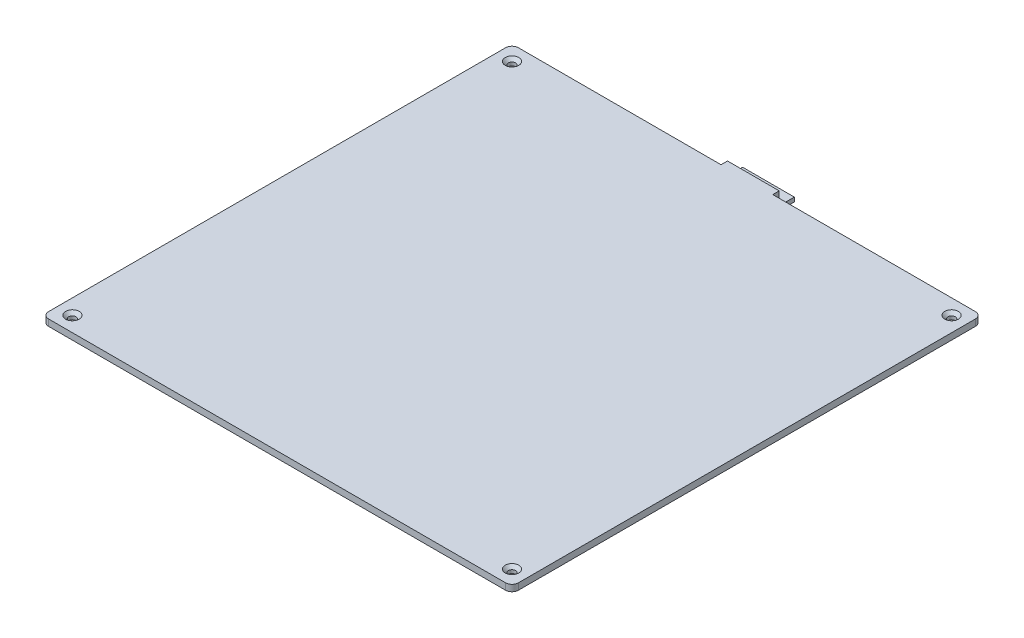
ISO-10303-21;
HEADER;
FILE_DESCRIPTION(('STEP AP214'),'2;1');
FILE_NAME('part.step','',(''),(''),'','','');
FILE_SCHEMA(('AUTOMOTIVE_DESIGN { 1 0 10303 214 1 1 1 1 }'));
ENDSEC;
DATA;
#1=APPLICATION_CONTEXT('core data for automotive mechanical design processes');
#2=APPLICATION_PROTOCOL_DEFINITION('international standard','automotive_design',2000,#1);
#3=PRODUCT_CONTEXT('',#1,'mechanical');
#4=PRODUCT('Part','Part','',(#3));
#5=PRODUCT_RELATED_PRODUCT_CATEGORY('part','',(#4));
#6=PRODUCT_DEFINITION_FORMATION('','',#4);
#7=PRODUCT_DEFINITION_CONTEXT('part definition',#1,'design');
#8=PRODUCT_DEFINITION('design','',#6,#7);
#9=PRODUCT_DEFINITION_SHAPE('','',#8);
#10=(LENGTH_UNIT() NAMED_UNIT(*) SI_UNIT(.MILLI.,.METRE.));
#11=(NAMED_UNIT(*) PLANE_ANGLE_UNIT() SI_UNIT($,.RADIAN.));
#12=(NAMED_UNIT(*) SI_UNIT($,.STERADIAN.) SOLID_ANGLE_UNIT());
#13=UNCERTAINTY_MEASURE_WITH_UNIT(LENGTH_MEASURE(1.E-05),#10,'distance_accuracy_value','');
#14=(GEOMETRIC_REPRESENTATION_CONTEXT(3) GLOBAL_UNCERTAINTY_ASSIGNED_CONTEXT((#13)) GLOBAL_UNIT_ASSIGNED_CONTEXT((#10,
#11,#12)) REPRESENTATION_CONTEXT('',''));
#15=CARTESIAN_POINT('',(0.,0.,0.));
#16=DIRECTION('',(0.,0.,1.));
#17=DIRECTION('',(1.,0.,0.));
#18=AXIS2_PLACEMENT_3D('',#15,#16,#17);
#19=CARTESIAN_POINT('',(-12.,-5.,-119.));
#20=DIRECTION('',(0.,0.,1.));
#21=DIRECTION('',(1.,0.,0.));
#22=AXIS2_PLACEMENT_3D('',#19,#20,#21);
#23=PLANE('',#22);
#24=DIRECTION('',(-1.,0.,0.));
#25=VECTOR('',#24,1.);
#26=CARTESIAN_POINT('',(12.,-3.,-119.));
#27=LINE('',#26,#25);
#28=CARTESIAN_POINT('',(12.,-3.,-119.));
#29=VERTEX_POINT('',#28);
#30=CARTESIAN_POINT('',(-12.,-3.,-119.));
#31=VERTEX_POINT('',#30);
#32=EDGE_CURVE('E155',#29,#31,#27,.T.);
#33=ORIENTED_EDGE('',*,*,#32,.F.);
#34=DIRECTION('',(0.,1.,0.));
#35=VECTOR('',#34,1.);
#36=CARTESIAN_POINT('',(12.,-5.,-119.));
#37=LINE('',#36,#35);
#38=CARTESIAN_POINT('',(12.,-5.,-119.));
#39=VERTEX_POINT('',#38);
#40=EDGE_CURVE('E185',#39,#29,#37,.T.);
#41=ORIENTED_EDGE('',*,*,#40,.F.);
#42=DIRECTION('',(1.,0.,0.));
#43=VECTOR('',#42,1.);
#44=CARTESIAN_POINT('',(-12.,-5.,-119.));
#45=LINE('',#44,#43);
#46=CARTESIAN_POINT('',(-12.,-5.,-119.));
#47=VERTEX_POINT('',#46);
#48=EDGE_CURVE('E175',#47,#39,#45,.T.);
#49=ORIENTED_EDGE('',*,*,#48,.F.);
#50=DIRECTION('',(0.,1.,0.));
#51=VECTOR('',#50,1.);
#52=CARTESIAN_POINT('',(-12.,-5.,-119.));
#53=LINE('',#52,#51);
#54=EDGE_CURVE('E188',#47,#31,#53,.T.);
#55=ORIENTED_EDGE('',*,*,#54,.T.);
#56=EDGE_LOOP('',(#33,#41,#49,#55));
#57=FACE_BOUND('',#56,.T.);
#58=ADVANCED_FACE('F36',(#57),#23,.F.);
#59=CARTESIAN_POINT('',(-106.,3.,-109.));
#60=DIRECTION('',(0.,0.,1.));
#61=DIRECTION('',(1.,0.,0.));
#62=AXIS2_PLACEMENT_3D('',#59,#60,#61);
#63=PLANE('',#62);
#64=DIRECTION('',(0.,1.,0.));
#65=VECTOR('',#64,1.);
#66=CARTESIAN_POINT('',(-12.,-5.,-109.));
#67=LINE('',#66,#65);
#68=CARTESIAN_POINT('',(-12.,0.,-109.));
#69=VERTEX_POINT('',#68);
#70=CARTESIAN_POINT('',(-12.,3.,-109.));
#71=VERTEX_POINT('',#70);
#72=EDGE_CURVE('E190',#69,#71,#67,.T.);
#73=ORIENTED_EDGE('',*,*,#72,.F.);
#74=DIRECTION('',(-1.,0.,0.));
#75=VECTOR('',#74,1.);
#76=CARTESIAN_POINT('',(-106.,0.,-109.));
#77=LINE('',#76,#75);
#78=CARTESIAN_POINT('',(-106.,0.,-109.));
#79=VERTEX_POINT('',#78);
#80=EDGE_CURVE('E261',#69,#79,#77,.T.);
#81=ORIENTED_EDGE('',*,*,#80,.T.);
#82=DIRECTION('',(0.,-1.,0.));
#83=VECTOR('',#82,1.);
#84=CARTESIAN_POINT('',(-106.,3.,-109.));
#85=LINE('',#84,#83);
#86=CARTESIAN_POINT('',(-106.,3.,-109.));
#87=VERTEX_POINT('',#86);
#88=EDGE_CURVE('E274',#87,#79,#85,.T.);
#89=ORIENTED_EDGE('',*,*,#88,.F.);
#90=DIRECTION('',(-1.,0.,0.));
#91=VECTOR('',#90,1.);
#92=CARTESIAN_POINT('',(-106.,3.,-109.));
#93=LINE('',#92,#91);
#94=EDGE_CURVE('E59',#71,#87,#93,.T.);
#95=ORIENTED_EDGE('',*,*,#94,.F.);
#96=EDGE_LOOP('',(#73,#81,#89,#95));
#97=FACE_BOUND('',#96,.T.);
#98=ADVANCED_FACE('F326',(#97),#63,.F.);
#99=DIRECTION('',(0.,1.,0.));
#100=VECTOR('',#99,1.);
#101=CARTESIAN_POINT('',(12.,-5.,-109.));
#102=LINE('',#101,#100);
#103=CARTESIAN_POINT('',(12.,0.,-109.));
#104=VERTEX_POINT('',#103);
#105=CARTESIAN_POINT('',(12.,3.,-109.));
#106=VERTEX_POINT('',#105);
#107=EDGE_CURVE('E179',#104,#106,#102,.T.);
#108=ORIENTED_EDGE('',*,*,#107,.T.);
#109=CARTESIAN_POINT('',(106.,3.,-109.));
#110=VERTEX_POINT('',#109);
#111=EDGE_CURVE('E243',#110,#106,#93,.T.);
#112=ORIENTED_EDGE('',*,*,#111,.F.);
#113=DIRECTION('',(0.,-1.,0.));
#114=VECTOR('',#113,1.);
#115=CARTESIAN_POINT('',(106.,3.,-109.));
#116=LINE('',#115,#114);
#117=CARTESIAN_POINT('',(106.,0.,-109.));
#118=VERTEX_POINT('',#117);
#119=EDGE_CURVE('E277',#110,#118,#116,.T.);
#120=ORIENTED_EDGE('',*,*,#119,.T.);
#121=EDGE_CURVE('E262',#118,#104,#77,.T.);
#122=ORIENTED_EDGE('',*,*,#121,.T.);
#123=EDGE_LOOP('',(#108,#112,#120,#122));
#124=FACE_BOUND('',#123,.T.);
#125=ADVANCED_FACE('F344',(#124),#63,.F.);
#126=CARTESIAN_POINT('',(-106.,3.,106.));
#127=DIRECTION('',(0.,-1.,0.));
#128=DIRECTION('',(0.,0.,-1.));
#129=AXIS2_PLACEMENT_3D('',#126,#127,#128);
#130=CYLINDRICAL_SURFACE('',#129,3.);
#131=CARTESIAN_POINT('',(-106.,0.,106.));
#132=DIRECTION('',(0.,1.,0.));
#133=DIRECTION('',(0.,0.,1.));
#134=AXIS2_PLACEMENT_3D('',#131,#132,#133);
#135=CIRCLE('',#134,3.);
#136=CARTESIAN_POINT('',(-109.,0.,106.));
#137=VERTEX_POINT('',#136);
#138=CARTESIAN_POINT('',(-106.,0.,109.));
#139=VERTEX_POINT('',#138);
#140=EDGE_CURVE('E230',#137,#139,#135,.T.);
#141=ORIENTED_EDGE('',*,*,#140,.T.);
#142=DIRECTION('',(0.,-1.,0.));
#143=VECTOR('',#142,1.);
#144=CARTESIAN_POINT('',(-106.,3.,109.));
#145=LINE('',#144,#143);
#146=CARTESIAN_POINT('',(-106.,3.,109.));
#147=VERTEX_POINT('',#146);
#148=EDGE_CURVE('E11',#147,#139,#145,.T.);
#149=ORIENTED_EDGE('',*,*,#148,.F.);
#150=CARTESIAN_POINT('',(-106.,3.,106.));
#151=DIRECTION('',(0.,1.,0.));
#152=DIRECTION('',(0.,0.,1.));
#153=AXIS2_PLACEMENT_3D('',#150,#151,#152);
#154=CIRCLE('',#153,3.);
#155=CARTESIAN_POINT('',(-109.,3.,106.));
#156=VERTEX_POINT('',#155);
#157=EDGE_CURVE('E231',#156,#147,#154,.T.);
#158=ORIENTED_EDGE('',*,*,#157,.F.);
#159=DIRECTION('',(0.,-1.,0.));
#160=VECTOR('',#159,1.);
#161=CARTESIAN_POINT('',(-109.,3.,106.));
#162=LINE('',#161,#160);
#163=EDGE_CURVE('E250',#156,#137,#162,.T.);
#164=ORIENTED_EDGE('',*,*,#163,.T.);
#165=EDGE_LOOP('',(#141,#149,#158,#164));
#166=FACE_BOUND('',#165,.T.);
#167=ADVANCED_FACE('F38',(#166),#130,.T.);
#168=CARTESIAN_POINT('',(-106.,3.,109.));
#169=DIRECTION('',(0.,0.,-1.));
#170=DIRECTION('',(-1.,0.,0.));
#171=AXIS2_PLACEMENT_3D('',#168,#169,#170);
#172=PLANE('',#171);
#173=DIRECTION('',(1.,0.,0.));
#174=VECTOR('',#173,1.);
#175=CARTESIAN_POINT('',(-106.,0.,109.));
#176=LINE('',#175,#174);
#177=CARTESIAN_POINT('',(106.,0.,109.));
#178=VERTEX_POINT('',#177);
#179=EDGE_CURVE('E253',#139,#178,#176,.T.);
#180=ORIENTED_EDGE('',*,*,#179,.T.);
#181=DIRECTION('',(0.,-1.,0.));
#182=VECTOR('',#181,1.);
#183=CARTESIAN_POINT('',(106.,3.,109.));
#184=LINE('',#183,#182);
#185=CARTESIAN_POINT('',(106.,3.,109.));
#186=VERTEX_POINT('',#185);
#187=EDGE_CURVE('E44',#186,#178,#184,.T.);
#188=ORIENTED_EDGE('',*,*,#187,.F.);
#189=DIRECTION('',(1.,0.,0.));
#190=VECTOR('',#189,1.);
#191=CARTESIAN_POINT('',(-106.,3.,109.));
#192=LINE('',#191,#190);
#193=EDGE_CURVE('E234',#147,#186,#192,.T.);
#194=ORIENTED_EDGE('',*,*,#193,.F.);
#195=ORIENTED_EDGE('',*,*,#148,.T.);
#196=EDGE_LOOP('',(#180,#188,#194,#195));
#197=FACE_BOUND('',#196,.T.);
#198=ADVANCED_FACE('F314',(#197),#172,.F.);
#199=CARTESIAN_POINT('',(106.,3.,106.));
#200=DIRECTION('',(0.,-1.,0.));
#201=DIRECTION('',(0.,0.,-1.));
#202=AXIS2_PLACEMENT_3D('',#199,#200,#201);
#203=CYLINDRICAL_SURFACE('',#202,3.);
#204=CARTESIAN_POINT('',(106.,0.,106.));
#205=DIRECTION('',(0.,1.,0.));
#206=DIRECTION('',(0.,0.,1.));
#207=AXIS2_PLACEMENT_3D('',#204,#205,#206);
#208=CIRCLE('',#207,3.);
#209=CARTESIAN_POINT('',(109.,0.,106.));
#210=VERTEX_POINT('',#209);
#211=EDGE_CURVE('E255',#178,#210,#208,.T.);
#212=ORIENTED_EDGE('',*,*,#211,.T.);
#213=DIRECTION('',(0.,-1.,0.));
#214=VECTOR('',#213,1.);
#215=CARTESIAN_POINT('',(109.,3.,106.));
#216=LINE('',#215,#214);
#217=CARTESIAN_POINT('',(109.,3.,106.));
#218=VERTEX_POINT('',#217);
#219=EDGE_CURVE('E283',#218,#210,#216,.T.);
#220=ORIENTED_EDGE('',*,*,#219,.F.);
#221=CARTESIAN_POINT('',(106.,3.,106.));
#222=DIRECTION('',(0.,1.,0.));
#223=DIRECTION('',(0.,0.,1.));
#224=AXIS2_PLACEMENT_3D('',#221,#222,#223);
#225=CIRCLE('',#224,3.);
#226=EDGE_CURVE('E237',#186,#218,#225,.T.);
#227=ORIENTED_EDGE('',*,*,#226,.F.);
#228=ORIENTED_EDGE('',*,*,#187,.T.);
#229=EDGE_LOOP('',(#212,#220,#227,#228));
#230=FACE_BOUND('',#229,.T.);
#231=ADVANCED_FACE('F290',(#230),#203,.T.);
#232=CARTESIAN_POINT('',(109.,3.,-106.));
#233=DIRECTION('',(-1.,0.,0.));
#234=DIRECTION('',(0.,0.,1.));
#235=AXIS2_PLACEMENT_3D('',#232,#233,#234);
#236=PLANE('',#235);
#237=DIRECTION('',(0.,0.,-1.));
#238=VECTOR('',#237,1.);
#239=CARTESIAN_POINT('',(109.,0.,-106.));
#240=LINE('',#239,#238);
#241=CARTESIAN_POINT('',(109.,0.,-106.));
#242=VERTEX_POINT('',#241);
#243=EDGE_CURVE('E257',#210,#242,#240,.T.);
#244=ORIENTED_EDGE('',*,*,#243,.T.);
#245=DIRECTION('',(0.,-1.,0.));
#246=VECTOR('',#245,1.);
#247=CARTESIAN_POINT('',(109.,3.,-106.));
#248=LINE('',#247,#246);
#249=CARTESIAN_POINT('',(109.,3.,-106.));
#250=VERTEX_POINT('',#249);
#251=EDGE_CURVE('E280',#250,#242,#248,.T.);
#252=ORIENTED_EDGE('',*,*,#251,.F.);
#253=DIRECTION('',(0.,0.,-1.));
#254=VECTOR('',#253,1.);
#255=CARTESIAN_POINT('',(109.,3.,-106.));
#256=LINE('',#255,#254);
#257=EDGE_CURVE('E239',#218,#250,#256,.T.);
#258=ORIENTED_EDGE('',*,*,#257,.F.);
#259=ORIENTED_EDGE('',*,*,#219,.T.);
#260=EDGE_LOOP('',(#244,#252,#258,#259));
#261=FACE_BOUND('',#260,.T.);
#262=ADVANCED_FACE('F301',(#261),#236,.F.);
#263=CARTESIAN_POINT('',(106.,3.,-106.));
#264=DIRECTION('',(0.,-1.,0.));
#265=DIRECTION('',(0.,0.,-1.));
#266=AXIS2_PLACEMENT_3D('',#263,#264,#265);
#267=CYLINDRICAL_SURFACE('',#266,3.00000000000001);
#268=CARTESIAN_POINT('',(106.,0.,-106.));
#269=DIRECTION('',(0.,1.,0.));
#270=DIRECTION('',(0.,0.,-1.));
#271=AXIS2_PLACEMENT_3D('',#268,#269,#270);
#272=CIRCLE('',#271,3.00000000000001);
#273=EDGE_CURVE('E259',#242,#118,#272,.T.);
#274=ORIENTED_EDGE('',*,*,#273,.T.);
#275=ORIENTED_EDGE('',*,*,#119,.F.);
#276=CARTESIAN_POINT('',(106.,3.,-106.));
#277=DIRECTION('',(0.,1.,0.));
#278=DIRECTION('',(0.,0.,-1.));
#279=AXIS2_PLACEMENT_3D('',#276,#277,#278);
#280=CIRCLE('',#279,3.00000000000001);
#281=EDGE_CURVE('E241',#250,#110,#280,.T.);
#282=ORIENTED_EDGE('',*,*,#281,.F.);
#283=ORIENTED_EDGE('',*,*,#251,.T.);
#284=EDGE_LOOP('',(#274,#275,#282,#283));
#285=FACE_BOUND('',#284,.T.);
#286=ADVANCED_FACE('F305',(#285),#267,.T.);
#287=CARTESIAN_POINT('',(-106.,3.,-106.));
#288=DIRECTION('',(0.,-1.,0.));
#289=DIRECTION('',(0.,0.,-1.));
#290=AXIS2_PLACEMENT_3D('',#287,#288,#289);
#291=CYLINDRICAL_SURFACE('',#290,3.);
#292=CARTESIAN_POINT('',(-106.,0.,-106.));
#293=DIRECTION('',(0.,1.,0.));
#294=DIRECTION('',(0.,0.,1.));
#295=AXIS2_PLACEMENT_3D('',#292,#293,#294);
#296=CIRCLE('',#295,3.);
#297=CARTESIAN_POINT('',(-109.,0.,-106.));
#298=VERTEX_POINT('',#297);
#299=EDGE_CURVE('E265',#79,#298,#296,.T.);
#300=ORIENTED_EDGE('',*,*,#299,.T.);
#301=DIRECTION('',(0.,-1.,0.));
#302=VECTOR('',#301,1.);
#303=CARTESIAN_POINT('',(-109.,3.,-106.));
#304=LINE('',#303,#302);
#305=CARTESIAN_POINT('',(-109.,3.,-106.));
#306=VERTEX_POINT('',#305);
#307=EDGE_CURVE('E271',#306,#298,#304,.T.);
#308=ORIENTED_EDGE('',*,*,#307,.F.);
#309=CARTESIAN_POINT('',(-106.,3.,-106.));
#310=DIRECTION('',(0.,1.,0.));
#311=DIRECTION('',(0.,0.,1.));
#312=AXIS2_PLACEMENT_3D('',#309,#310,#311);
#313=CIRCLE('',#312,3.);
#314=EDGE_CURVE('E246',#87,#306,#313,.T.);
#315=ORIENTED_EDGE('',*,*,#314,.F.);
#316=ORIENTED_EDGE('',*,*,#88,.T.);
#317=EDGE_LOOP('',(#300,#308,#315,#316));
#318=FACE_BOUND('',#317,.T.);
#319=ADVANCED_FACE('F325',(#318),#291,.T.);
#320=CARTESIAN_POINT('',(-109.,3.,-106.));
#321=DIRECTION('',(1.,0.,0.));
#322=DIRECTION('',(0.,0.,-1.));
#323=AXIS2_PLACEMENT_3D('',#320,#321,#322);
#324=PLANE('',#323);
#325=DIRECTION('',(0.,0.,1.));
#326=VECTOR('',#325,1.);
#327=CARTESIAN_POINT('',(-109.,0.,-106.));
#328=LINE('',#327,#326);
#329=EDGE_CURVE('E235',#298,#137,#328,.T.);
#330=ORIENTED_EDGE('',*,*,#329,.T.);
#331=ORIENTED_EDGE('',*,*,#163,.F.);
#332=DIRECTION('',(0.,0.,1.));
#333=VECTOR('',#332,1.);
#334=CARTESIAN_POINT('',(-109.,3.,-106.));
#335=LINE('',#334,#333);
#336=EDGE_CURVE('E248',#306,#156,#335,.T.);
#337=ORIENTED_EDGE('',*,*,#336,.F.);
#338=ORIENTED_EDGE('',*,*,#307,.T.);
#339=EDGE_LOOP('',(#330,#331,#337,#338));
#340=FACE_BOUND('',#339,.T.);
#341=ADVANCED_FACE('F320',(#340),#324,.F.);
#342=CARTESIAN_POINT('',(-106.,3.,106.));
#343=DIRECTION('',(0.,1.,0.));
#344=DIRECTION('',(0.,0.,1.));
#345=AXIS2_PLACEMENT_3D('',#342,#343,#344);
#346=PLANE('',#345);
#347=DIRECTION('',(1.,0.,0.));
#348=VECTOR('',#347,1.);
#349=CARTESIAN_POINT('',(-12.,3.,-112.));
#350=LINE('',#349,#348);
#351=CARTESIAN_POINT('',(-12.,3.,-112.));
#352=VERTEX_POINT('',#351);
#353=CARTESIAN_POINT('',(12.,3.,-112.));
#354=VERTEX_POINT('',#353);
#355=EDGE_CURVE('E159',#352,#354,#350,.T.);
#356=ORIENTED_EDGE('',*,*,#355,.F.);
#357=DIRECTION('',(0.,0.,-1.));
#358=VECTOR('',#357,1.);
#359=CARTESIAN_POINT('',(-12.,3.,-109.));
#360=LINE('',#359,#358);
#361=EDGE_CURVE('E164',#71,#352,#360,.T.);
#362=ORIENTED_EDGE('',*,*,#361,.F.);
#363=ORIENTED_EDGE('',*,*,#94,.T.);
#364=ORIENTED_EDGE('',*,*,#314,.T.);
#365=ORIENTED_EDGE('',*,*,#336,.T.);
#366=ORIENTED_EDGE('',*,*,#157,.T.);
#367=ORIENTED_EDGE('',*,*,#193,.T.);
#368=ORIENTED_EDGE('',*,*,#226,.T.);
#369=ORIENTED_EDGE('',*,*,#257,.T.);
#370=ORIENTED_EDGE('',*,*,#281,.T.);
#371=ORIENTED_EDGE('',*,*,#111,.T.);
#372=DIRECTION('',(0.,0.,1.));
#373=VECTOR('',#372,1.);
#374=CARTESIAN_POINT('',(12.,3.,-119.));
#375=LINE('',#374,#373);
#376=EDGE_CURVE('E173',#354,#106,#375,.T.);
#377=ORIENTED_EDGE('',*,*,#376,.F.);
#378=EDGE_LOOP('',(#356,#362,#363,#364,#365,#366,#367,#368,#369,#370,#371,#377));
#379=FACE_BOUND('',#378,.T.);
#380=CARTESIAN_POINT('',(-102.,3.,-102.));
#381=DIRECTION('',(0.,1.,0.));
#382=DIRECTION('',(0.,0.,1.));
#383=AXIS2_PLACEMENT_3D('',#380,#381,#382);
#384=CIRCLE('',#383,3.15);
#385=CARTESIAN_POINT('',(-102.,3.,-98.85));
#386=VERTEX_POINT('',#385);
#387=EDGE_CURVE('E194',#386,#386,#384,.T.);
#388=ORIENTED_EDGE('',*,*,#387,.F.);
#389=EDGE_LOOP('',(#388));
#390=FACE_BOUND('',#389,.T.);
#391=CARTESIAN_POINT('',(-102.,3.,102.));
#392=DIRECTION('',(0.,1.,0.));
#393=DIRECTION('',(0.,0.,1.));
#394=AXIS2_PLACEMENT_3D('',#391,#392,#393);
#395=CIRCLE('',#394,3.15);
#396=CARTESIAN_POINT('',(-102.,3.,105.15));
#397=VERTEX_POINT('',#396);
#398=EDGE_CURVE('E203',#397,#397,#395,.T.);
#399=ORIENTED_EDGE('',*,*,#398,.F.);
#400=EDGE_LOOP('',(#399));
#401=FACE_BOUND('',#400,.T.);
#402=CARTESIAN_POINT('',(102.,3.,102.));
#403=DIRECTION('',(0.,1.,0.));
#404=DIRECTION('',(0.,0.,1.));
#405=AXIS2_PLACEMENT_3D('',#402,#403,#404);
#406=CIRCLE('',#405,3.15);
#407=CARTESIAN_POINT('',(102.,3.,105.15));
#408=VERTEX_POINT('',#407);
#409=EDGE_CURVE('E212',#408,#408,#406,.T.);
#410=ORIENTED_EDGE('',*,*,#409,.F.);
#411=EDGE_LOOP('',(#410));
#412=FACE_BOUND('',#411,.T.);
#413=CARTESIAN_POINT('',(102.,3.,-102.));
#414=DIRECTION('',(0.,1.,0.));
#415=DIRECTION('',(0.,0.,1.));
#416=AXIS2_PLACEMENT_3D('',#413,#414,#415);
#417=CIRCLE('',#416,3.15);
#418=CARTESIAN_POINT('',(102.,3.,-98.85));
#419=VERTEX_POINT('',#418);
#420=EDGE_CURVE('E221',#419,#419,#417,.T.);
#421=ORIENTED_EDGE('',*,*,#420,.F.);
#422=EDGE_LOOP('',(#421));
#423=FACE_BOUND('',#422,.T.);
#424=ADVANCED_FACE('F309',(#379,#390,#401,#412,#423),#346,.T.);
#425=CARTESIAN_POINT('',(-106.,0.,106.));
#426=DIRECTION('',(0.,1.,0.));
#427=DIRECTION('',(0.,0.,1.));
#428=AXIS2_PLACEMENT_3D('',#425,#426,#427);
#429=PLANE('',#428);
#430=CARTESIAN_POINT('',(-102.,0.,-102.));
#431=DIRECTION('',(0.,1.,0.));
#432=DIRECTION('',(0.,0.,1.));
#433=AXIS2_PLACEMENT_3D('',#430,#431,#432);
#434=CIRCLE('',#433,1.69999999999999);
#435=CARTESIAN_POINT('',(-102.,0.,-100.3));
#436=VERTEX_POINT('',#435);
#437=EDGE_CURVE('E200',#436,#436,#434,.T.);
#438=ORIENTED_EDGE('',*,*,#437,.T.);
#439=EDGE_LOOP('',(#438));
#440=FACE_BOUND('',#439,.T.);
#441=CARTESIAN_POINT('',(-102.,0.,102.));
#442=DIRECTION('',(0.,1.,0.));
#443=DIRECTION('',(0.,0.,1.));
#444=AXIS2_PLACEMENT_3D('',#441,#442,#443);
#445=CIRCLE('',#444,1.69999999999999);
#446=CARTESIAN_POINT('',(-102.,0.,103.7));
#447=VERTEX_POINT('',#446);
#448=EDGE_CURVE('E209',#447,#447,#445,.T.);
#449=ORIENTED_EDGE('',*,*,#448,.T.);
#450=EDGE_LOOP('',(#449));
#451=FACE_BOUND('',#450,.T.);
#452=CARTESIAN_POINT('',(102.,0.,102.));
#453=DIRECTION('',(0.,1.,0.));
#454=DIRECTION('',(0.,0.,1.));
#455=AXIS2_PLACEMENT_3D('',#452,#453,#454);
#456=CIRCLE('',#455,1.69999999999999);
#457=CARTESIAN_POINT('',(102.,0.,103.7));
#458=VERTEX_POINT('',#457);
#459=EDGE_CURVE('E218',#458,#458,#456,.T.);
#460=ORIENTED_EDGE('',*,*,#459,.T.);
#461=EDGE_LOOP('',(#460));
#462=FACE_BOUND('',#461,.T.);
#463=CARTESIAN_POINT('',(102.,0.,-102.));
#464=DIRECTION('',(0.,1.,0.));
#465=DIRECTION('',(0.,0.,1.));
#466=AXIS2_PLACEMENT_3D('',#463,#464,#465);
#467=CIRCLE('',#466,1.69999999999999);
#468=CARTESIAN_POINT('',(102.,0.,-100.3));
#469=VERTEX_POINT('',#468);
#470=EDGE_CURVE('E227',#469,#469,#467,.T.);
#471=ORIENTED_EDGE('',*,*,#470,.T.);
#472=EDGE_LOOP('',(#471));
#473=FACE_BOUND('',#472,.T.);
#474=ORIENTED_EDGE('',*,*,#140,.F.);
#475=ORIENTED_EDGE('',*,*,#329,.F.);
#476=ORIENTED_EDGE('',*,*,#299,.F.);
#477=ORIENTED_EDGE('',*,*,#80,.F.);
#478=EDGE_CURVE('E266',#104,#69,#77,.T.);
#479=ORIENTED_EDGE('',*,*,#478,.F.);
#480=ORIENTED_EDGE('',*,*,#121,.F.);
#481=ORIENTED_EDGE('',*,*,#273,.F.);
#482=ORIENTED_EDGE('',*,*,#243,.F.);
#483=ORIENTED_EDGE('',*,*,#211,.F.);
#484=ORIENTED_EDGE('',*,*,#179,.F.);
#485=EDGE_LOOP('',(#474,#475,#476,#477,#479,#480,#481,#482,#483,#484));
#486=FACE_BOUND('',#485,.T.);
#487=ADVANCED_FACE('F296',(#440,#451,#462,#473,#486),#429,.F.);
#488=CARTESIAN_POINT('',(102.,3.,-102.));
#489=DIRECTION('',(0.,1.,0.));
#490=DIRECTION('',(0.,0.,1.));
#491=AXIS2_PLACEMENT_3D('',#488,#489,#490);
#492=CYLINDRICAL_SURFACE('',#491,1.69999999999999);
#493=ORIENTED_EDGE('',*,*,#470,.F.);
#494=EDGE_LOOP('',(#493));
#495=FACE_BOUND('',#494,.T.);
#496=CARTESIAN_POINT('',(102.,1.55,-102.));
#497=DIRECTION('',(0.,1.,0.));
#498=DIRECTION('',(0.,0.,1.));
#499=AXIS2_PLACEMENT_3D('',#496,#497,#498);
#500=CIRCLE('',#499,1.69999999999999);
#501=CARTESIAN_POINT('',(102.,1.55,-100.3));
#502=VERTEX_POINT('',#501);
#503=EDGE_CURVE('E224',#502,#502,#500,.T.);
#504=ORIENTED_EDGE('',*,*,#503,.T.);
#505=EDGE_LOOP('',(#504));
#506=FACE_BOUND('',#505,.T.);
#507=ADVANCED_FACE('F392',(#495,#506),#492,.F.);
#508=CARTESIAN_POINT('',(102.,3.,-102.));
#509=DIRECTION('',(0.,1.,0.));
#510=DIRECTION('',(0.,0.,1.));
#511=AXIS2_PLACEMENT_3D('',#508,#509,#510);
#512=CONICAL_SURFACE('',#511,3.15,0.785398163397451);
#513=ORIENTED_EDGE('',*,*,#503,.F.);
#514=EDGE_LOOP('',(#513));
#515=FACE_BOUND('',#514,.T.);
#516=ORIENTED_EDGE('',*,*,#420,.T.);
#517=EDGE_LOOP('',(#516));
#518=FACE_BOUND('',#517,.T.);
#519=ADVANCED_FACE('F388',(#515,#518),#512,.F.);
#520=CARTESIAN_POINT('',(102.,3.,102.));
#521=DIRECTION('',(0.,1.,0.));
#522=DIRECTION('',(0.,0.,1.));
#523=AXIS2_PLACEMENT_3D('',#520,#521,#522);
#524=CYLINDRICAL_SURFACE('',#523,1.69999999999999);
#525=ORIENTED_EDGE('',*,*,#459,.F.);
#526=EDGE_LOOP('',(#525));
#527=FACE_BOUND('',#526,.T.);
#528=CARTESIAN_POINT('',(102.,1.55,102.));
#529=DIRECTION('',(0.,1.,0.));
#530=DIRECTION('',(0.,0.,1.));
#531=AXIS2_PLACEMENT_3D('',#528,#529,#530);
#532=CIRCLE('',#531,1.69999999999999);
#533=CARTESIAN_POINT('',(102.,1.55,103.7));
#534=VERTEX_POINT('',#533);
#535=EDGE_CURVE('E215',#534,#534,#532,.T.);
#536=ORIENTED_EDGE('',*,*,#535,.T.);
#537=EDGE_LOOP('',(#536));
#538=FACE_BOUND('',#537,.T.);
#539=ADVANCED_FACE('F384',(#527,#538),#524,.F.);
#540=CARTESIAN_POINT('',(102.,3.,102.));
#541=DIRECTION('',(0.,1.,0.));
#542=DIRECTION('',(0.,0.,1.));
#543=AXIS2_PLACEMENT_3D('',#540,#541,#542);
#544=CONICAL_SURFACE('',#543,3.15,0.785398163397451);
#545=ORIENTED_EDGE('',*,*,#535,.F.);
#546=EDGE_LOOP('',(#545));
#547=FACE_BOUND('',#546,.T.);
#548=ORIENTED_EDGE('',*,*,#409,.T.);
#549=EDGE_LOOP('',(#548));
#550=FACE_BOUND('',#549,.T.);
#551=ADVANCED_FACE('F380',(#547,#550),#544,.F.);
#552=CARTESIAN_POINT('',(-102.,3.,102.));
#553=DIRECTION('',(0.,1.,0.));
#554=DIRECTION('',(0.,0.,1.));
#555=AXIS2_PLACEMENT_3D('',#552,#553,#554);
#556=CYLINDRICAL_SURFACE('',#555,1.69999999999999);
#557=ORIENTED_EDGE('',*,*,#448,.F.);
#558=EDGE_LOOP('',(#557));
#559=FACE_BOUND('',#558,.T.);
#560=CARTESIAN_POINT('',(-102.,1.55,102.));
#561=DIRECTION('',(0.,1.,0.));
#562=DIRECTION('',(0.,0.,1.));
#563=AXIS2_PLACEMENT_3D('',#560,#561,#562);
#564=CIRCLE('',#563,1.69999999999999);
#565=CARTESIAN_POINT('',(-102.,1.55,103.7));
#566=VERTEX_POINT('',#565);
#567=EDGE_CURVE('E206',#566,#566,#564,.T.);
#568=ORIENTED_EDGE('',*,*,#567,.T.);
#569=EDGE_LOOP('',(#568));
#570=FACE_BOUND('',#569,.T.);
#571=ADVANCED_FACE('F376',(#559,#570),#556,.F.);
#572=CARTESIAN_POINT('',(-102.,3.,102.));
#573=DIRECTION('',(0.,1.,0.));
#574=DIRECTION('',(0.,0.,1.));
#575=AXIS2_PLACEMENT_3D('',#572,#573,#574);
#576=CONICAL_SURFACE('',#575,3.15,0.785398163397451);
#577=ORIENTED_EDGE('',*,*,#567,.F.);
#578=EDGE_LOOP('',(#577));
#579=FACE_BOUND('',#578,.T.);
#580=ORIENTED_EDGE('',*,*,#398,.T.);
#581=EDGE_LOOP('',(#580));
#582=FACE_BOUND('',#581,.T.);
#583=ADVANCED_FACE('F372',(#579,#582),#576,.F.);
#584=CARTESIAN_POINT('',(-102.,3.,-102.));
#585=DIRECTION('',(0.,1.,0.));
#586=DIRECTION('',(0.,0.,1.));
#587=AXIS2_PLACEMENT_3D('',#584,#585,#586);
#588=CYLINDRICAL_SURFACE('',#587,1.69999999999999);
#589=ORIENTED_EDGE('',*,*,#437,.F.);
#590=EDGE_LOOP('',(#589));
#591=FACE_BOUND('',#590,.T.);
#592=CARTESIAN_POINT('',(-102.,1.55,-102.));
#593=DIRECTION('',(0.,1.,0.));
#594=DIRECTION('',(0.,0.,1.));
#595=AXIS2_PLACEMENT_3D('',#592,#593,#594);
#596=CIRCLE('',#595,1.69999999999999);
#597=CARTESIAN_POINT('',(-102.,1.55,-100.3));
#598=VERTEX_POINT('',#597);
#599=EDGE_CURVE('E197',#598,#598,#596,.T.);
#600=ORIENTED_EDGE('',*,*,#599,.T.);
#601=EDGE_LOOP('',(#600));
#602=FACE_BOUND('',#601,.T.);
#603=ADVANCED_FACE('F368',(#591,#602),#588,.F.);
#604=CARTESIAN_POINT('',(-102.,3.,-102.));
#605=DIRECTION('',(0.,1.,0.));
#606=DIRECTION('',(0.,0.,1.));
#607=AXIS2_PLACEMENT_3D('',#604,#605,#606);
#608=CONICAL_SURFACE('',#607,3.15,0.785398163397451);
#609=ORIENTED_EDGE('',*,*,#599,.F.);
#610=EDGE_LOOP('',(#609));
#611=FACE_BOUND('',#610,.T.);
#612=ORIENTED_EDGE('',*,*,#387,.T.);
#613=EDGE_LOOP('',(#612));
#614=FACE_BOUND('',#613,.T.);
#615=ADVANCED_FACE('F365',(#611,#614),#608,.F.);
#616=CARTESIAN_POINT('',(0.,-5.,-109.));
#617=DIRECTION('',(0.,0.,-1.));
#618=DIRECTION('',(-1.,0.,0.));
#619=AXIS2_PLACEMENT_3D('',#616,#617,#618);
#620=PLANE('',#619);
#621=CARTESIAN_POINT('',(12.,-5.,-109.));
#622=VERTEX_POINT('',#621);
#623=EDGE_CURVE('E182',#622,#104,#102,.T.);
#624=ORIENTED_EDGE('',*,*,#623,.T.);
#625=ORIENTED_EDGE('',*,*,#478,.T.);
#626=CARTESIAN_POINT('',(-12.,-5.,-109.));
#627=VERTEX_POINT('',#626);
#628=EDGE_CURVE('E191',#627,#69,#67,.T.);
#629=ORIENTED_EDGE('',*,*,#628,.F.);
#630=DIRECTION('',(-1.,0.,0.));
#631=VECTOR('',#630,1.);
#632=CARTESIAN_POINT('',(12.,-5.,-109.));
#633=LINE('',#632,#631);
#634=EDGE_CURVE('E170',#622,#627,#633,.T.);
#635=ORIENTED_EDGE('',*,*,#634,.F.);
#636=EDGE_LOOP('',(#624,#625,#629,#635));
#637=FACE_BOUND('',#636,.T.);
#638=ADVANCED_FACE('F330',(#637),#620,.F.);
#639=CARTESIAN_POINT('',(-12.,-5.,-109.));
#640=DIRECTION('',(1.,0.,0.));
#641=DIRECTION('',(0.,0.,-1.));
#642=AXIS2_PLACEMENT_3D('',#639,#640,#641);
#643=PLANE('',#642);
#644=ORIENTED_EDGE('',*,*,#361,.T.);
#645=DIRECTION('',(0.,1.,0.));
#646=VECTOR('',#645,1.);
#647=CARTESIAN_POINT('',(-12.,-3.,-112.));
#648=LINE('',#647,#646);
#649=CARTESIAN_POINT('',(-12.,-3.,-112.));
#650=VERTEX_POINT('',#649);
#651=EDGE_CURVE('E144',#650,#352,#648,.T.);
#652=ORIENTED_EDGE('',*,*,#651,.F.);
#653=DIRECTION('',(0.,0.,1.));
#654=VECTOR('',#653,1.);
#655=CARTESIAN_POINT('',(-12.,-3.,-119.));
#656=LINE('',#655,#654);
#657=EDGE_CURVE('E150',#31,#650,#656,.T.);
#658=ORIENTED_EDGE('',*,*,#657,.F.);
#659=ORIENTED_EDGE('',*,*,#54,.F.);
#660=DIRECTION('',(0.,0.,-1.));
#661=VECTOR('',#660,1.);
#662=CARTESIAN_POINT('',(-12.,-5.,-109.));
#663=LINE('',#662,#661);
#664=EDGE_CURVE('E172',#627,#47,#663,.T.);
#665=ORIENTED_EDGE('',*,*,#664,.F.);
#666=ORIENTED_EDGE('',*,*,#628,.T.);
#667=ORIENTED_EDGE('',*,*,#72,.T.);
#668=EDGE_LOOP('',(#644,#652,#658,#659,#665,#666,#667));
#669=FACE_BOUND('',#668,.T.);
#670=ADVANCED_FACE('F162',(#669),#643,.F.);
#671=CARTESIAN_POINT('',(12.,-5.,-119.));
#672=DIRECTION('',(-1.,0.,0.));
#673=DIRECTION('',(0.,0.,1.));
#674=AXIS2_PLACEMENT_3D('',#671,#672,#673);
#675=PLANE('',#674);
#676=DIRECTION('',(0.,0.,-1.));
#677=VECTOR('',#676,1.);
#678=CARTESIAN_POINT('',(12.,-3.,-112.));
#679=LINE('',#678,#677);
#680=CARTESIAN_POINT('',(12.,-3.,-112.));
#681=VERTEX_POINT('',#680);
#682=EDGE_CURVE('E149',#681,#29,#679,.T.);
#683=ORIENTED_EDGE('',*,*,#682,.F.);
#684=DIRECTION('',(0.,1.,0.));
#685=VECTOR('',#684,1.);
#686=CARTESIAN_POINT('',(12.,-3.,-112.));
#687=LINE('',#686,#685);
#688=EDGE_CURVE('E147',#681,#354,#687,.T.);
#689=ORIENTED_EDGE('',*,*,#688,.T.);
#690=ORIENTED_EDGE('',*,*,#376,.T.);
#691=ORIENTED_EDGE('',*,*,#107,.F.);
#692=ORIENTED_EDGE('',*,*,#623,.F.);
#693=DIRECTION('',(0.,0.,1.));
#694=VECTOR('',#693,1.);
#695=CARTESIAN_POINT('',(12.,-5.,-119.));
#696=LINE('',#695,#694);
#697=EDGE_CURVE('E177',#39,#622,#696,.T.);
#698=ORIENTED_EDGE('',*,*,#697,.F.);
#699=ORIENTED_EDGE('',*,*,#40,.T.);
#700=EDGE_LOOP('',(#683,#689,#690,#691,#692,#698,#699));
#701=FACE_BOUND('',#700,.T.);
#702=ADVANCED_FACE('F341',(#701),#675,.F.);
#703=CARTESIAN_POINT('',(0.,-5.,0.));
#704=DIRECTION('',(0.,-1.,0.));
#705=DIRECTION('',(0.,0.,-1.));
#706=AXIS2_PLACEMENT_3D('',#703,#704,#705);
#707=PLANE('',#706);
#708=ORIENTED_EDGE('',*,*,#634,.T.);
#709=ORIENTED_EDGE('',*,*,#664,.T.);
#710=ORIENTED_EDGE('',*,*,#48,.T.);
#711=ORIENTED_EDGE('',*,*,#697,.T.);
#712=EDGE_LOOP('',(#708,#709,#710,#711));
#713=FACE_BOUND('',#712,.T.);
#714=ADVANCED_FACE('F336',(#713),#707,.T.);
#715=CARTESIAN_POINT('',(-12.,-3.,-112.));
#716=DIRECTION('',(0.,0.,1.));
#717=DIRECTION('',(1.,0.,0.));
#718=AXIS2_PLACEMENT_3D('',#715,#716,#717);
#719=PLANE('',#718);
#720=ORIENTED_EDGE('',*,*,#355,.T.);
#721=ORIENTED_EDGE('',*,*,#688,.F.);
#722=DIRECTION('',(1.,0.,0.));
#723=VECTOR('',#722,1.);
#724=CARTESIAN_POINT('',(-12.,-3.,-112.));
#725=LINE('',#724,#723);
#726=EDGE_CURVE('E51',#650,#681,#725,.T.);
#727=ORIENTED_EDGE('',*,*,#726,.F.);
#728=ORIENTED_EDGE('',*,*,#651,.T.);
#729=EDGE_LOOP('',(#720,#721,#727,#728));
#730=FACE_BOUND('',#729,.T.);
#731=ADVANCED_FACE('F142',(#730),#719,.F.);
#732=CARTESIAN_POINT('',(0.,-3.,0.));
#733=DIRECTION('',(0.,1.,0.));
#734=DIRECTION('',(0.,0.,1.));
#735=AXIS2_PLACEMENT_3D('',#732,#733,#734);
#736=PLANE('',#735);
#737=ORIENTED_EDGE('',*,*,#657,.T.);
#738=ORIENTED_EDGE('',*,*,#726,.T.);
#739=ORIENTED_EDGE('',*,*,#682,.T.);
#740=ORIENTED_EDGE('',*,*,#32,.T.);
#741=EDGE_LOOP('',(#737,#738,#739,#740));
#742=FACE_BOUND('',#741,.T.);
#743=ADVANCED_FACE('F153',(#742),#736,.T.);
#744=CLOSED_SHELL('',(#58,#98,#125,#167,#198,#231,#262,#286,#319,#341,#424,#487,#507,#519,#539,
#551,#571,#583,#603,#615,#638,#670,#702,#714,#731,#743));
#745=MANIFOLD_SOLID_BREP('B2',#744);
#746=ADVANCED_BREP_SHAPE_REPRESENTATION('',(#18,#745),#14);
#747=SHAPE_DEFINITION_REPRESENTATION(#9,#746);
ENDSEC;
END-ISO-10303-21;
